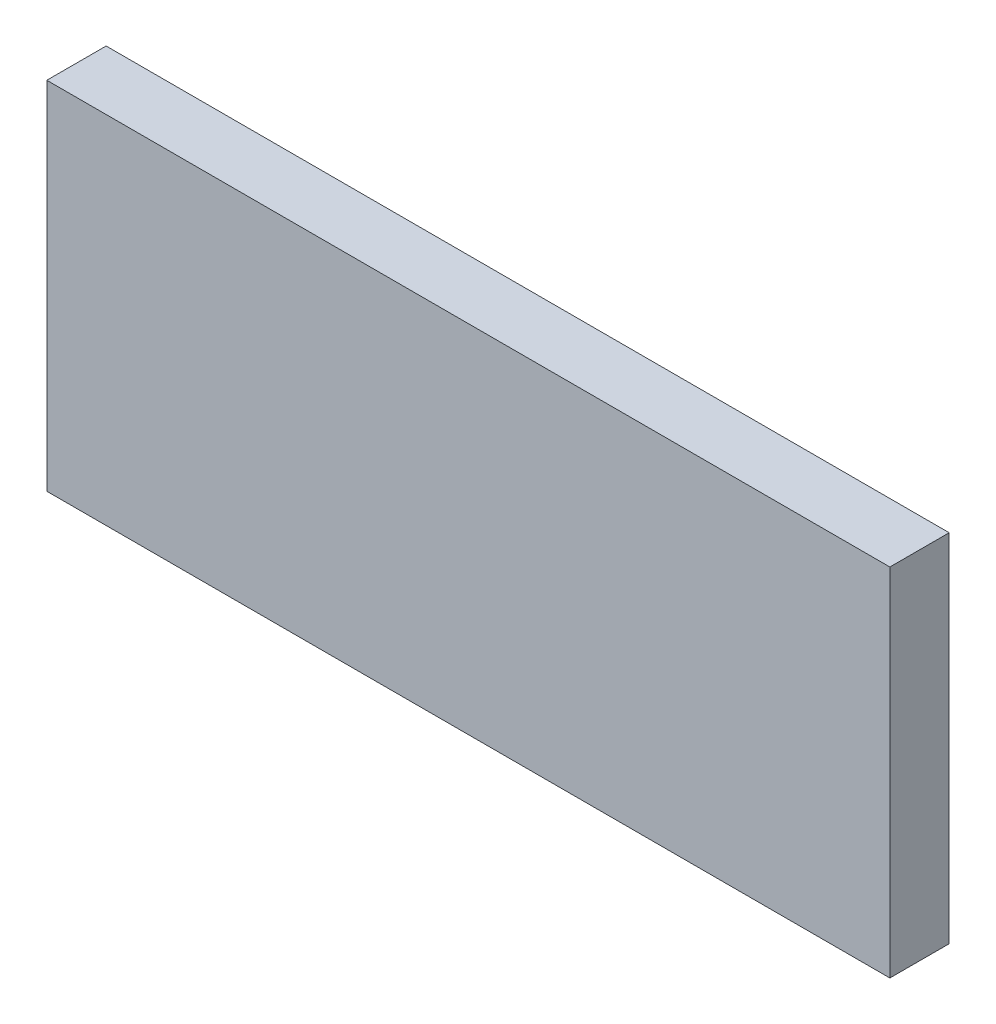
ISO-10303-21;
HEADER;
FILE_DESCRIPTION(('STEP AP214'),'2;1');
FILE_NAME('part.step','',(''),(''),'','','');
FILE_SCHEMA(('AUTOMOTIVE_DESIGN { 1 0 10303 214 1 1 1 1 }'));
ENDSEC;
DATA;
#1=APPLICATION_CONTEXT('core data for automotive mechanical design processes');
#2=APPLICATION_PROTOCOL_DEFINITION('international standard','automotive_design',2000,#1);
#3=PRODUCT_CONTEXT('',#1,'mechanical');
#4=PRODUCT('Part','Part','',(#3));
#5=PRODUCT_RELATED_PRODUCT_CATEGORY('part','',(#4));
#6=PRODUCT_DEFINITION_FORMATION('','',#4);
#7=PRODUCT_DEFINITION_CONTEXT('part definition',#1,'design');
#8=PRODUCT_DEFINITION('design','',#6,#7);
#9=PRODUCT_DEFINITION_SHAPE('','',#8);
#10=(LENGTH_UNIT() NAMED_UNIT(*) SI_UNIT(.MILLI.,.METRE.));
#11=(NAMED_UNIT(*) PLANE_ANGLE_UNIT() SI_UNIT($,.RADIAN.));
#12=(NAMED_UNIT(*) SI_UNIT($,.STERADIAN.) SOLID_ANGLE_UNIT());
#13=UNCERTAINTY_MEASURE_WITH_UNIT(LENGTH_MEASURE(1.E-05),#10,'distance_accuracy_value','');
#14=(GEOMETRIC_REPRESENTATION_CONTEXT(3) GLOBAL_UNCERTAINTY_ASSIGNED_CONTEXT((#13)) GLOBAL_UNIT_ASSIGNED_CONTEXT((#10,
#11,#12)) REPRESENTATION_CONTEXT('',''));
#15=CARTESIAN_POINT('',(0.,0.,0.));
#16=DIRECTION('',(0.,0.,1.));
#17=DIRECTION('',(1.,0.,0.));
#18=AXIS2_PLACEMENT_3D('',#15,#16,#17);
#19=CARTESIAN_POINT('',(-13.5,-5.7,1.9));
#20=DIRECTION('',(1.,0.,0.));
#21=DIRECTION('',(0.,0.,-1.));
#22=AXIS2_PLACEMENT_3D('',#19,#20,#21);
#23=PLANE('',#22);
#24=DIRECTION('',(0.,-1.,0.));
#25=VECTOR('',#24,1.);
#26=CARTESIAN_POINT('',(-13.5,-5.7,0.));
#27=LINE('',#26,#25);
#28=CARTESIAN_POINT('',(-13.5,5.7,0.));
#29=VERTEX_POINT('',#28);
#30=CARTESIAN_POINT('',(-13.5,-5.7,0.));
#31=VERTEX_POINT('',#30);
#32=EDGE_CURVE('E11',#29,#31,#27,.T.);
#33=ORIENTED_EDGE('',*,*,#32,.T.);
#34=DIRECTION('',(0.,0.,-1.));
#35=VECTOR('',#34,1.);
#36=CARTESIAN_POINT('',(-13.5,-5.7,1.9));
#37=LINE('',#36,#35);
#38=CARTESIAN_POINT('',(-13.5,-5.7,1.9));
#39=VERTEX_POINT('',#38);
#40=EDGE_CURVE('E24',#39,#31,#37,.T.);
#41=ORIENTED_EDGE('',*,*,#40,.F.);
#42=DIRECTION('',(0.,-1.,0.));
#43=VECTOR('',#42,1.);
#44=CARTESIAN_POINT('',(-13.5,-5.7,1.9));
#45=LINE('',#44,#43);
#46=CARTESIAN_POINT('',(-13.5,5.7,1.9));
#47=VERTEX_POINT('',#46);
#48=EDGE_CURVE('E88',#47,#39,#45,.T.);
#49=ORIENTED_EDGE('',*,*,#48,.F.);
#50=DIRECTION('',(0.,0.,-1.));
#51=VECTOR('',#50,1.);
#52=CARTESIAN_POINT('',(-13.5,5.7,1.9));
#53=LINE('',#52,#51);
#54=EDGE_CURVE('E77',#47,#29,#53,.T.);
#55=ORIENTED_EDGE('',*,*,#54,.T.);
#56=EDGE_LOOP('',(#33,#41,#49,#55));
#57=FACE_BOUND('',#56,.T.);
#58=ADVANCED_FACE('F17',(#57),#23,.F.);
#59=CARTESIAN_POINT('',(13.5,-5.7,1.9));
#60=DIRECTION('',(0.,1.,0.));
#61=DIRECTION('',(-1.,0.,0.));
#62=AXIS2_PLACEMENT_3D('',#59,#60,#61);
#63=PLANE('',#62);
#64=DIRECTION('',(1.,0.,0.));
#65=VECTOR('',#64,1.);
#66=CARTESIAN_POINT('',(13.5,-5.7,0.));
#67=LINE('',#66,#65);
#68=CARTESIAN_POINT('',(13.5,-5.7,0.));
#69=VERTEX_POINT('',#68);
#70=EDGE_CURVE('E85',#31,#69,#67,.T.);
#71=ORIENTED_EDGE('',*,*,#70,.T.);
#72=DIRECTION('',(0.,0.,-1.));
#73=VECTOR('',#72,1.);
#74=CARTESIAN_POINT('',(13.5,-5.7,1.9));
#75=LINE('',#74,#73);
#76=CARTESIAN_POINT('',(13.5,-5.7,1.9));
#77=VERTEX_POINT('',#76);
#78=EDGE_CURVE('E83',#77,#69,#75,.T.);
#79=ORIENTED_EDGE('',*,*,#78,.F.);
#80=DIRECTION('',(1.,0.,0.));
#81=VECTOR('',#80,1.);
#82=CARTESIAN_POINT('',(13.5,-5.7,1.9));
#83=LINE('',#82,#81);
#84=EDGE_CURVE('E72',#39,#77,#83,.T.);
#85=ORIENTED_EDGE('',*,*,#84,.F.);
#86=ORIENTED_EDGE('',*,*,#40,.T.);
#87=EDGE_LOOP('',(#71,#79,#85,#86));
#88=FACE_BOUND('',#87,.T.);
#89=ADVANCED_FACE('F90',(#88),#63,.F.);
#90=CARTESIAN_POINT('',(13.5,-5.7,1.9));
#91=DIRECTION('',(-1.,0.,0.));
#92=DIRECTION('',(0.,0.,1.));
#93=AXIS2_PLACEMENT_3D('',#90,#91,#92);
#94=PLANE('',#93);
#95=DIRECTION('',(0.,1.,0.));
#96=VECTOR('',#95,1.);
#97=CARTESIAN_POINT('',(13.5,-5.7,0.));
#98=LINE('',#97,#96);
#99=CARTESIAN_POINT('',(13.5,5.7,0.));
#100=VERTEX_POINT('',#99);
#101=EDGE_CURVE('E60',#69,#100,#98,.T.);
#102=ORIENTED_EDGE('',*,*,#101,.T.);
#103=DIRECTION('',(0.,0.,-1.));
#104=VECTOR('',#103,1.);
#105=CARTESIAN_POINT('',(13.5,5.7,1.9));
#106=LINE('',#105,#104);
#107=CARTESIAN_POINT('',(13.5,5.7,1.9));
#108=VERTEX_POINT('',#107);
#109=EDGE_CURVE('E54',#108,#100,#106,.T.);
#110=ORIENTED_EDGE('',*,*,#109,.F.);
#111=DIRECTION('',(0.,1.,0.));
#112=VECTOR('',#111,1.);
#113=CARTESIAN_POINT('',(13.5,-5.7,1.9));
#114=LINE('',#113,#112);
#115=EDGE_CURVE('E58',#77,#108,#114,.T.);
#116=ORIENTED_EDGE('',*,*,#115,.F.);
#117=ORIENTED_EDGE('',*,*,#78,.T.);
#118=EDGE_LOOP('',(#102,#110,#116,#117));
#119=FACE_BOUND('',#118,.T.);
#120=ADVANCED_FACE('F56',(#119),#94,.F.);
#121=CARTESIAN_POINT('',(13.5,5.7,1.9));
#122=DIRECTION('',(0.,-1.,0.));
#123=DIRECTION('',(1.,0.,0.));
#124=AXIS2_PLACEMENT_3D('',#121,#122,#123);
#125=PLANE('',#124);
#126=DIRECTION('',(-1.,0.,0.));
#127=VECTOR('',#126,1.);
#128=CARTESIAN_POINT('',(13.5,5.7,0.));
#129=LINE('',#128,#127);
#130=EDGE_CURVE('E73',#100,#29,#129,.T.);
#131=ORIENTED_EDGE('',*,*,#130,.T.);
#132=ORIENTED_EDGE('',*,*,#54,.F.);
#133=DIRECTION('',(-1.,0.,0.));
#134=VECTOR('',#133,1.);
#135=CARTESIAN_POINT('',(13.5,5.7,1.9));
#136=LINE('',#135,#134);
#137=EDGE_CURVE('E70',#108,#47,#136,.T.);
#138=ORIENTED_EDGE('',*,*,#137,.F.);
#139=ORIENTED_EDGE('',*,*,#109,.T.);
#140=EDGE_LOOP('',(#131,#132,#138,#139));
#141=FACE_BOUND('',#140,.T.);
#142=ADVANCED_FACE('F76',(#141),#125,.F.);
#143=CARTESIAN_POINT('',(0.,0.,1.9));
#144=DIRECTION('',(0.,0.,1.));
#145=DIRECTION('',(1.,0.,0.));
#146=AXIS2_PLACEMENT_3D('',#143,#144,#145);
#147=PLANE('',#146);
#148=ORIENTED_EDGE('',*,*,#48,.T.);
#149=ORIENTED_EDGE('',*,*,#84,.T.);
#150=ORIENTED_EDGE('',*,*,#115,.T.);
#151=ORIENTED_EDGE('',*,*,#137,.T.);
#152=EDGE_LOOP('',(#148,#149,#150,#151));
#153=FACE_BOUND('',#152,.T.);
#154=ADVANCED_FACE('F69',(#153),#147,.T.);
#155=CARTESIAN_POINT('',(0.,0.,0.));
#156=DIRECTION('',(0.,0.,1.));
#157=DIRECTION('',(1.,0.,0.));
#158=AXIS2_PLACEMENT_3D('',#155,#156,#157);
#159=PLANE('',#158);
#160=ORIENTED_EDGE('',*,*,#32,.F.);
#161=ORIENTED_EDGE('',*,*,#130,.F.);
#162=ORIENTED_EDGE('',*,*,#101,.F.);
#163=ORIENTED_EDGE('',*,*,#70,.F.);
#164=EDGE_LOOP('',(#160,#161,#162,#163));
#165=FACE_BOUND('',#164,.T.);
#166=ADVANCED_FACE('F91',(#165),#159,.F.);
#167=CLOSED_SHELL('',(#58,#89,#120,#142,#154,#166));
#168=MANIFOLD_SOLID_BREP('B1',#167);
#169=ADVANCED_BREP_SHAPE_REPRESENTATION('',(#18,#168),#14);
#170=SHAPE_DEFINITION_REPRESENTATION(#9,#169);
ENDSEC;
END-ISO-10303-21;
